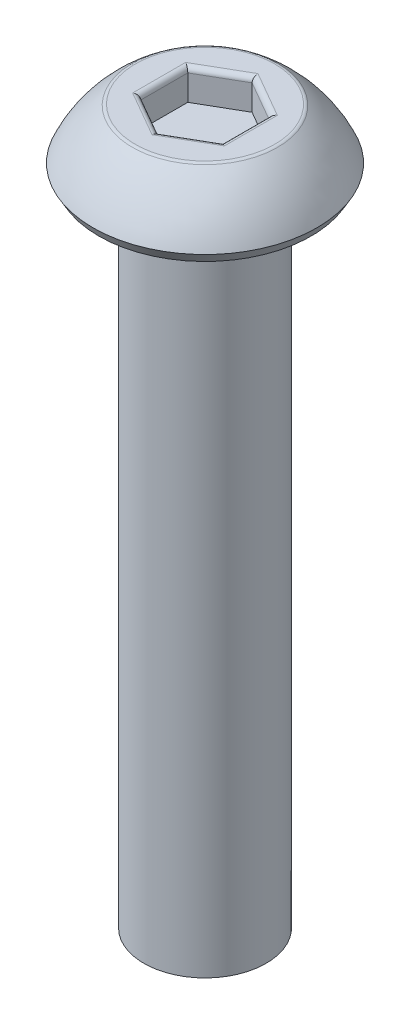
ISO-10303-21;
HEADER;
FILE_DESCRIPTION(('STEP AP214'),'2;1');
FILE_NAME('part.step','',(''),(''),'','','');
FILE_SCHEMA(('AUTOMOTIVE_DESIGN { 1 0 10303 214 1 1 1 1 }'));
ENDSEC;
DATA;
#1=APPLICATION_CONTEXT('core data for automotive mechanical design processes');
#2=APPLICATION_PROTOCOL_DEFINITION('international standard','automotive_design',2000,#1);
#3=PRODUCT_CONTEXT('',#1,'mechanical');
#4=PRODUCT('Part','Part','',(#3));
#5=PRODUCT_RELATED_PRODUCT_CATEGORY('part','',(#4));
#6=PRODUCT_DEFINITION_FORMATION('','',#4);
#7=PRODUCT_DEFINITION_CONTEXT('part definition',#1,'design');
#8=PRODUCT_DEFINITION('design','',#6,#7);
#9=PRODUCT_DEFINITION_SHAPE('','',#8);
#10=(LENGTH_UNIT() NAMED_UNIT(*) SI_UNIT(.MILLI.,.METRE.));
#11=(NAMED_UNIT(*) PLANE_ANGLE_UNIT() SI_UNIT($,.RADIAN.));
#12=(NAMED_UNIT(*) SI_UNIT($,.STERADIAN.) SOLID_ANGLE_UNIT());
#13=UNCERTAINTY_MEASURE_WITH_UNIT(LENGTH_MEASURE(1.E-05),#10,'distance_accuracy_value','');
#14=(GEOMETRIC_REPRESENTATION_CONTEXT(3) GLOBAL_UNCERTAINTY_ASSIGNED_CONTEXT((#13)) GLOBAL_UNIT_ASSIGNED_CONTEXT((#10,
#11,#12)) REPRESENTATION_CONTEXT('',''));
#15=CARTESIAN_POINT('',(0.,0.,0.));
#16=DIRECTION('',(0.,0.,1.));
#17=DIRECTION('',(1.,0.,0.));
#18=AXIS2_PLACEMENT_3D('',#15,#16,#17);
#19=CARTESIAN_POINT('',(0.,1.5,0.));
#20=DIRECTION('',(0.,-1.,0.));
#21=DIRECTION('',(0.,0.,-1.));
#22=AXIS2_PLACEMENT_3D('',#19,#20,#21);
#23=PLANE('',#22);
#24=CARTESIAN_POINT('',(0.,1.5,0.));
#25=DIRECTION('',(0.,-1.,0.));
#26=DIRECTION('',(0.,0.,-1.));
#27=AXIS2_PLACEMENT_3D('',#24,#25,#26);
#28=CIRCLE('',#27,1.70906948191647);
#29=CARTESIAN_POINT('',(0.,1.5,-1.70906948191647));
#30=VERTEX_POINT('',#29);
#31=EDGE_CURVE('E177',#30,#30,#28,.F.);
#32=ORIENTED_EDGE('',*,*,#31,.T.);
#33=EDGE_LOOP('',(#32));
#34=FACE_BOUND('',#33,.T.);
#35=DIRECTION('',(0.866025403784439,0.,-0.5));
#36=VECTOR('',#35,1.);
#37=CARTESIAN_POINT('',(0.5625,1.5,0.974278579257493));
#38=LINE('',#37,#36);
#39=CARTESIAN_POINT('',(1.125,1.5,0.649519052838329));
#40=VERTEX_POINT('',#39);
#41=CARTESIAN_POINT('',(0.,1.5,1.29903810567666));
#42=VERTEX_POINT('',#41);
#43=EDGE_CURVE('E172',#40,#42,#38,.F.);
#44=ORIENTED_EDGE('',*,*,#43,.T.);
#45=DIRECTION('',(0.866025403784439,0.,0.5));
#46=VECTOR('',#45,1.);
#47=CARTESIAN_POINT('',(-0.5625,1.5,0.974278579257493));
#48=LINE('',#47,#46);
#49=CARTESIAN_POINT('',(-1.125,1.5,0.649519052838329));
#50=VERTEX_POINT('',#49);
#51=EDGE_CURVE('E174',#42,#50,#48,.F.);
#52=ORIENTED_EDGE('',*,*,#51,.T.);
#53=DIRECTION('',(0.,0.,1.));
#54=VECTOR('',#53,1.);
#55=CARTESIAN_POINT('',(-1.125,1.5,0.));
#56=LINE('',#55,#54);
#57=CARTESIAN_POINT('',(-1.125,1.5,-0.649519052838329));
#58=VERTEX_POINT('',#57);
#59=EDGE_CURVE('E164',#50,#58,#56,.F.);
#60=ORIENTED_EDGE('',*,*,#59,.T.);
#61=DIRECTION('',(-0.866025403784439,0.,0.5));
#62=VECTOR('',#61,1.);
#63=CARTESIAN_POINT('',(-0.5625,1.5,-0.974278579257493));
#64=LINE('',#63,#62);
#65=CARTESIAN_POINT('',(0.,1.5,-1.29903810567666));
#66=VERTEX_POINT('',#65);
#67=EDGE_CURVE('E166',#58,#66,#64,.F.);
#68=ORIENTED_EDGE('',*,*,#67,.T.);
#69=DIRECTION('',(-0.866025403784439,0.,-0.5));
#70=VECTOR('',#69,1.);
#71=CARTESIAN_POINT('',(0.5625,1.5,-0.974278579257494));
#72=LINE('',#71,#70);
#73=CARTESIAN_POINT('',(1.125,1.5,-0.64951905283833));
#74=VERTEX_POINT('',#73);
#75=EDGE_CURVE('E168',#66,#74,#72,.F.);
#76=ORIENTED_EDGE('',*,*,#75,.T.);
#77=DIRECTION('',(0.,0.,-1.));
#78=VECTOR('',#77,1.);
#79=CARTESIAN_POINT('',(1.125,1.5,0.));
#80=LINE('',#79,#78);
#81=EDGE_CURVE('E170',#74,#40,#80,.F.);
#82=ORIENTED_EDGE('',*,*,#81,.T.);
#83=EDGE_LOOP('',(#44,#52,#60,#68,#76,#82));
#84=FACE_BOUND('',#83,.T.);
#85=ADVANCED_FACE('F35',(#34,#84),#23,.F.);
#86=CARTESIAN_POINT('',(0.,-0.931154789034212,0.));
#87=DIRECTION('',(0.,-1.,0.));
#88=DIRECTION('',(0.,0.,-1.));
#89=AXIS2_PLACEMENT_3D('',#86,#87,#88);
#90=DEGENERATE_TOROIDAL_SURFACE('',#89,0.00769348629276519,3.,.F.);
#91=CARTESIAN_POINT('',(0.,1.47526759952323,0.));
#92=DIRECTION('',(0.,-1.,0.));
#93=DIRECTION('',(0.,0.,-1.));
#94=AXIS2_PLACEMENT_3D('',#91,#92,#93);
#95=CIRCLE('',#94,1.78371135009948);
#96=CARTESIAN_POINT('',(0.,1.47526759952323,-1.78371135009948));
#97=VERTEX_POINT('',#96);
#98=EDGE_CURVE('E161',#97,#97,#95,.T.);
#99=ORIENTED_EDGE('',*,*,#98,.T.);
#100=EDGE_LOOP('',(#99));
#101=FACE_BOUND('',#100,.T.);
#102=CARTESIAN_POINT('',(0.,0.25,0.));
#103=DIRECTION('',(0.,-1.,0.));
#104=DIRECTION('',(0.,0.,-1.));
#105=AXIS2_PLACEMENT_3D('',#102,#103,#104);
#106=CIRCLE('',#105,2.75);
#107=CARTESIAN_POINT('',(0.,0.25,-2.75));
#108=VERTEX_POINT('',#107);
#109=EDGE_CURVE('E158',#108,#108,#106,.T.);
#110=ORIENTED_EDGE('',*,*,#109,.F.);
#111=EDGE_LOOP('',(#110));
#112=FACE_BOUND('',#111,.T.);
#113=ADVANCED_FACE('F244',(#101,#112),#90,.F.);
#114=CARTESIAN_POINT('',(0.,0.25,0.));
#115=DIRECTION('',(0.,1.,0.));
#116=DIRECTION('',(0.,0.,1.));
#117=AXIS2_PLACEMENT_3D('',#114,#115,#116);
#118=CONICAL_SURFACE('',#117,2.75,0.523598775598296);
#119=CARTESIAN_POINT('',(0.,0.,0.));
#120=DIRECTION('',(0.,-1.,0.));
#121=DIRECTION('',(0.,0.,-1.));
#122=AXIS2_PLACEMENT_3D('',#119,#120,#121);
#123=CIRCLE('',#122,2.60566243270259);
#124=CARTESIAN_POINT('',(0.,0.,-2.60566243270259));
#125=VERTEX_POINT('',#124);
#126=EDGE_CURVE('E155',#125,#125,#123,.T.);
#127=ORIENTED_EDGE('',*,*,#126,.F.);
#128=EDGE_LOOP('',(#127));
#129=FACE_BOUND('',#128,.T.);
#130=ORIENTED_EDGE('',*,*,#109,.T.);
#131=EDGE_LOOP('',(#130));
#132=FACE_BOUND('',#131,.T.);
#133=ADVANCED_FACE('F250',(#129,#132),#118,.T.);
#134=CARTESIAN_POINT('',(0.,0.,2.60566243270259));
#135=DIRECTION('',(0.,1.,0.));
#136=DIRECTION('',(0.,0.,1.));
#137=AXIS2_PLACEMENT_3D('',#134,#135,#136);
#138=PLANE('',#137);
#139=CARTESIAN_POINT('',(0.,0.,0.));
#140=DIRECTION('',(0.,-1.,0.));
#141=DIRECTION('',(0.,0.,-1.));
#142=AXIS2_PLACEMENT_3D('',#139,#140,#141);
#143=CIRCLE('',#142,1.5);
#144=CARTESIAN_POINT('',(0.,0.,-1.5));
#145=VERTEX_POINT('',#144);
#146=EDGE_CURVE('E152',#145,#145,#143,.T.);
#147=ORIENTED_EDGE('',*,*,#146,.F.);
#148=EDGE_LOOP('',(#147));
#149=FACE_BOUND('',#148,.T.);
#150=ORIENTED_EDGE('',*,*,#126,.T.);
#151=EDGE_LOOP('',(#150));
#152=FACE_BOUND('',#151,.T.);
#153=ADVANCED_FACE('F269',(#149,#152),#138,.F.);
#154=CARTESIAN_POINT('',(0.,-16.,0.));
#155=DIRECTION('',(0.,-1.,0.));
#156=DIRECTION('',(0.,0.,-1.));
#157=AXIS2_PLACEMENT_3D('',#154,#155,#156);
#158=CYLINDRICAL_SURFACE('',#157,1.5);
#159=CARTESIAN_POINT('',(0.,-16.,0.));
#160=DIRECTION('',(0.,-1.,0.));
#161=DIRECTION('',(0.,0.,-1.));
#162=AXIS2_PLACEMENT_3D('',#159,#160,#161);
#163=CIRCLE('',#162,1.5);
#164=CARTESIAN_POINT('',(0.,-16.,-1.5));
#165=VERTEX_POINT('',#164);
#166=EDGE_CURVE('E139',#165,#165,#163,.T.);
#167=ORIENTED_EDGE('',*,*,#166,.F.);
#168=EDGE_LOOP('',(#167));
#169=FACE_BOUND('',#168,.T.);
#170=ORIENTED_EDGE('',*,*,#146,.T.);
#171=EDGE_LOOP('',(#170));
#172=FACE_BOUND('',#171,.T.);
#173=ADVANCED_FACE('F274',(#169,#172),#158,.T.);
#174=CARTESIAN_POINT('',(0.,-16.,1.5));
#175=DIRECTION('',(0.,1.,0.));
#176=DIRECTION('',(0.,0.,1.));
#177=AXIS2_PLACEMENT_3D('',#174,#175,#176);
#178=PLANE('',#177);
#179=ORIENTED_EDGE('',*,*,#166,.T.);
#180=EDGE_LOOP('',(#179));
#181=FACE_BOUND('',#180,.T.);
#182=ADVANCED_FACE('F281',(#181),#178,.F.);
#183=CARTESIAN_POINT('',(0.999999999999999,0.75,-0.577350269189626));
#184=DIRECTION('',(0.5,0.,-0.866025403784439));
#185=DIRECTION('',(-0.866025403784439,0.,-0.5));
#186=AXIS2_PLACEMENT_3D('',#183,#184,#185);
#187=PLANE('',#186);
#188=DIRECTION('',(0.,1.,0.));
#189=VECTOR('',#188,1.);
#190=CARTESIAN_POINT('',(0.999999999999999,0.75,-0.577350269189626));
#191=LINE('',#190,#189);
#192=CARTESIAN_POINT('',(0.999999999999999,0.75,-0.577350269189626));
#193=VERTEX_POINT('',#192);
#194=CARTESIAN_POINT('',(0.999999999999999,1.375,-0.577350269189626));
#195=VERTEX_POINT('',#194);
#196=EDGE_CURVE('E137',#193,#195,#191,.T.);
#197=ORIENTED_EDGE('',*,*,#196,.T.);
#198=DIRECTION('',(-0.866025403784439,0.,-0.5));
#199=VECTOR('',#198,1.);
#200=CARTESIAN_POINT('',(0.999999999999999,1.375,-0.577350269189626));
#201=LINE('',#200,#199);
#202=CARTESIAN_POINT('',(0.,1.375,-1.15470053837925));
#203=VERTEX_POINT('',#202);
#204=EDGE_CURVE('E59',#195,#203,#201,.T.);
#205=ORIENTED_EDGE('',*,*,#204,.T.);
#206=DIRECTION('',(0.,1.,0.));
#207=VECTOR('',#206,1.);
#208=CARTESIAN_POINT('',(0.,0.75,-1.15470053837925));
#209=LINE('',#208,#207);
#210=CARTESIAN_POINT('',(0.,0.75,-1.15470053837925));
#211=VERTEX_POINT('',#210);
#212=EDGE_CURVE('E105',#211,#203,#209,.T.);
#213=ORIENTED_EDGE('',*,*,#212,.F.);
#214=DIRECTION('',(-0.866025403784439,0.,-0.5));
#215=VECTOR('',#214,1.);
#216=CARTESIAN_POINT('',(0.999999999999999,0.75,-0.577350269189626));
#217=LINE('',#216,#215);
#218=EDGE_CURVE('E109',#193,#211,#217,.T.);
#219=ORIENTED_EDGE('',*,*,#218,.F.);
#220=EDGE_LOOP('',(#197,#205,#213,#219));
#221=FACE_BOUND('',#220,.T.);
#222=ADVANCED_FACE('F107',(#221),#187,.F.);
#223=CARTESIAN_POINT('',(1.,0.75,0.577350269189626));
#224=DIRECTION('',(1.,0.,0.));
#225=DIRECTION('',(0.,0.,-1.));
#226=AXIS2_PLACEMENT_3D('',#223,#224,#225);
#227=PLANE('',#226);
#228=DIRECTION('',(0.,1.,0.));
#229=VECTOR('',#228,1.);
#230=CARTESIAN_POINT('',(1.,0.75,0.577350269189626));
#231=LINE('',#230,#229);
#232=CARTESIAN_POINT('',(1.,0.75,0.577350269189626));
#233=VERTEX_POINT('',#232);
#234=CARTESIAN_POINT('',(1.,1.375,0.577350269189626));
#235=VERTEX_POINT('',#234);
#236=EDGE_CURVE('E140',#233,#235,#231,.T.);
#237=ORIENTED_EDGE('',*,*,#236,.T.);
#238=DIRECTION('',(0.,0.,-1.));
#239=VECTOR('',#238,1.);
#240=CARTESIAN_POINT('',(1.,1.375,0.577350269189626));
#241=LINE('',#240,#239);
#242=EDGE_CURVE('E185',#235,#195,#241,.T.);
#243=ORIENTED_EDGE('',*,*,#242,.T.);
#244=ORIENTED_EDGE('',*,*,#196,.F.);
#245=DIRECTION('',(0.,0.,-1.));
#246=VECTOR('',#245,1.);
#247=CARTESIAN_POINT('',(1.,0.75,0.577350269189626));
#248=LINE('',#247,#246);
#249=EDGE_CURVE('E113',#233,#193,#248,.T.);
#250=ORIENTED_EDGE('',*,*,#249,.F.);
#251=EDGE_LOOP('',(#237,#243,#244,#250));
#252=FACE_BOUND('',#251,.T.);
#253=ADVANCED_FACE('F225',(#252),#227,.F.);
#254=CARTESIAN_POINT('',(0.,0.75,1.15470053837925));
#255=DIRECTION('',(0.5,0.,0.866025403784439));
#256=DIRECTION('',(0.866025403784439,0.,-0.5));
#257=AXIS2_PLACEMENT_3D('',#254,#255,#256);
#258=PLANE('',#257);
#259=DIRECTION('',(0.,1.,0.));
#260=VECTOR('',#259,1.);
#261=CARTESIAN_POINT('',(0.,0.75,1.15470053837925));
#262=LINE('',#261,#260);
#263=CARTESIAN_POINT('',(0.,0.75,1.15470053837925));
#264=VERTEX_POINT('',#263);
#265=CARTESIAN_POINT('',(0.,1.375,1.15470053837925));
#266=VERTEX_POINT('',#265);
#267=EDGE_CURVE('E143',#264,#266,#262,.T.);
#268=ORIENTED_EDGE('',*,*,#267,.T.);
#269=DIRECTION('',(0.866025403784439,0.,-0.5));
#270=VECTOR('',#269,1.);
#271=CARTESIAN_POINT('',(0.,1.375,1.15470053837925));
#272=LINE('',#271,#270);
#273=EDGE_CURVE('E183',#266,#235,#272,.T.);
#274=ORIENTED_EDGE('',*,*,#273,.T.);
#275=ORIENTED_EDGE('',*,*,#236,.F.);
#276=DIRECTION('',(0.866025403784439,0.,-0.5));
#277=VECTOR('',#276,1.);
#278=CARTESIAN_POINT('',(0.,0.75,1.15470053837925));
#279=LINE('',#278,#277);
#280=EDGE_CURVE('E134',#264,#233,#279,.T.);
#281=ORIENTED_EDGE('',*,*,#280,.F.);
#282=EDGE_LOOP('',(#268,#274,#275,#281));
#283=FACE_BOUND('',#282,.T.);
#284=ADVANCED_FACE('F226',(#283),#258,.F.);
#285=CARTESIAN_POINT('',(-0.999999999999999,0.75,0.577350269189626));
#286=DIRECTION('',(-0.5,0.,0.866025403784439));
#287=DIRECTION('',(0.866025403784439,0.,0.5));
#288=AXIS2_PLACEMENT_3D('',#285,#286,#287);
#289=PLANE('',#288);
#290=DIRECTION('',(0.,1.,0.));
#291=VECTOR('',#290,1.);
#292=CARTESIAN_POINT('',(-0.999999999999999,0.75,0.577350269189626));
#293=LINE('',#292,#291);
#294=CARTESIAN_POINT('',(-0.999999999999999,0.75,0.577350269189626));
#295=VERTEX_POINT('',#294);
#296=CARTESIAN_POINT('',(-0.999999999999999,1.375,0.577350269189626));
#297=VERTEX_POINT('',#296);
#298=EDGE_CURVE('E146',#295,#297,#293,.T.);
#299=ORIENTED_EDGE('',*,*,#298,.T.);
#300=DIRECTION('',(0.866025403784439,0.,0.5));
#301=VECTOR('',#300,1.);
#302=CARTESIAN_POINT('',(-0.999999999999999,1.375,0.577350269189626));
#303=LINE('',#302,#301);
#304=EDGE_CURVE('E180',#297,#266,#303,.T.);
#305=ORIENTED_EDGE('',*,*,#304,.T.);
#306=ORIENTED_EDGE('',*,*,#267,.F.);
#307=DIRECTION('',(0.866025403784439,0.,0.5));
#308=VECTOR('',#307,1.);
#309=CARTESIAN_POINT('',(-0.999999999999999,0.75,0.577350269189626));
#310=LINE('',#309,#308);
#311=EDGE_CURVE('E131',#295,#264,#310,.T.);
#312=ORIENTED_EDGE('',*,*,#311,.F.);
#313=EDGE_LOOP('',(#299,#305,#306,#312));
#314=FACE_BOUND('',#313,.T.);
#315=ADVANCED_FACE('F221',(#314),#289,.F.);
#316=CARTESIAN_POINT('',(-1.,0.75,-0.577350269189626));
#317=DIRECTION('',(-1.,0.,0.));
#318=DIRECTION('',(0.,0.,1.));
#319=AXIS2_PLACEMENT_3D('',#316,#317,#318);
#320=PLANE('',#319);
#321=DIRECTION('',(0.,1.,0.));
#322=VECTOR('',#321,1.);
#323=CARTESIAN_POINT('',(-1.,0.75,-0.577350269189626));
#324=LINE('',#323,#322);
#325=CARTESIAN_POINT('',(-1.,0.75,-0.577350269189626));
#326=VERTEX_POINT('',#325);
#327=CARTESIAN_POINT('',(-1.,1.375,-0.577350269189626));
#328=VERTEX_POINT('',#327);
#329=EDGE_CURVE('E112',#326,#328,#324,.T.);
#330=ORIENTED_EDGE('',*,*,#329,.T.);
#331=DIRECTION('',(0.,0.,1.));
#332=VECTOR('',#331,1.);
#333=CARTESIAN_POINT('',(-1.,1.375,-0.577350269189626));
#334=LINE('',#333,#332);
#335=EDGE_CURVE('E11',#328,#297,#334,.T.);
#336=ORIENTED_EDGE('',*,*,#335,.T.);
#337=ORIENTED_EDGE('',*,*,#298,.F.);
#338=DIRECTION('',(0.,0.,1.));
#339=VECTOR('',#338,1.);
#340=CARTESIAN_POINT('',(-1.,0.75,-0.577350269189626));
#341=LINE('',#340,#339);
#342=EDGE_CURVE('E121',#326,#295,#341,.T.);
#343=ORIENTED_EDGE('',*,*,#342,.F.);
#344=EDGE_LOOP('',(#330,#336,#337,#343));
#345=FACE_BOUND('',#344,.T.);
#346=ADVANCED_FACE('F218',(#345),#320,.F.);
#347=CARTESIAN_POINT('',(0.,0.75,-1.15470053837925));
#348=DIRECTION('',(-0.5,0.,-0.866025403784438));
#349=DIRECTION('',(-0.866025403784439,0.,0.5));
#350=AXIS2_PLACEMENT_3D('',#347,#348,#349);
#351=PLANE('',#350);
#352=ORIENTED_EDGE('',*,*,#212,.T.);
#353=DIRECTION('',(-0.866025403784439,0.,0.5));
#354=VECTOR('',#353,1.);
#355=CARTESIAN_POINT('',(0.,1.375,-1.15470053837925));
#356=LINE('',#355,#354);
#357=EDGE_CURVE('E44',#203,#328,#356,.T.);
#358=ORIENTED_EDGE('',*,*,#357,.T.);
#359=ORIENTED_EDGE('',*,*,#329,.F.);
#360=DIRECTION('',(-0.866025403784439,0.,0.5));
#361=VECTOR('',#360,1.);
#362=CARTESIAN_POINT('',(0.,0.75,-1.15470053837925));
#363=LINE('',#362,#361);
#364=EDGE_CURVE('E116',#211,#326,#363,.T.);
#365=ORIENTED_EDGE('',*,*,#364,.F.);
#366=EDGE_LOOP('',(#352,#358,#359,#365));
#367=FACE_BOUND('',#366,.T.);
#368=ADVANCED_FACE('F117',(#367),#351,.F.);
#369=CARTESIAN_POINT('',(0.,0.75,0.));
#370=DIRECTION('',(0.,1.,0.));
#371=DIRECTION('',(0.,0.,1.));
#372=AXIS2_PLACEMENT_3D('',#369,#370,#371);
#373=PLANE('',#372);
#374=ORIENTED_EDGE('',*,*,#218,.T.);
#375=ORIENTED_EDGE('',*,*,#364,.T.);
#376=ORIENTED_EDGE('',*,*,#342,.T.);
#377=ORIENTED_EDGE('',*,*,#311,.T.);
#378=ORIENTED_EDGE('',*,*,#280,.T.);
#379=ORIENTED_EDGE('',*,*,#249,.T.);
#380=EDGE_LOOP('',(#374,#375,#376,#377,#378,#379));
#381=FACE_BOUND('',#380,.T.);
#382=ADVANCED_FACE('F123',(#381),#373,.T.);
#383=CARTESIAN_POINT('',(0.,1.375,0.));
#384=DIRECTION('',(0.,-1.,0.));
#385=DIRECTION('',(0.,0.,-1.));
#386=AXIS2_PLACEMENT_3D('',#383,#384,#385);
#387=TOROIDAL_SURFACE('',#386,1.70906948191647,0.125);
#388=ORIENTED_EDGE('',*,*,#31,.F.);
#389=EDGE_LOOP('',(#388));
#390=FACE_BOUND('',#389,.T.);
#391=ORIENTED_EDGE('',*,*,#98,.F.);
#392=EDGE_LOOP('',(#391));
#393=FACE_BOUND('',#392,.T.);
#394=ADVANCED_FACE('F254',(#390,#393),#387,.T.);
#395=CARTESIAN_POINT('',(1.0625,1.375,-0.685603444662681));
#396=DIRECTION('',(-0.866025403784439,0.,-0.5));
#397=DIRECTION('',(-0.5,0.,0.866025403784439));
#398=AXIS2_PLACEMENT_3D('',#395,#396,#397);
#399=CYLINDRICAL_SURFACE('',#398,0.125);
#400=CARTESIAN_POINT('',(1.125,1.375,-0.64951905283833));
#401=DIRECTION('',(-0.5,0.,-0.866025403784438));
#402=DIRECTION('',(0.866025403784439,0.,-0.5));
#403=AXIS2_PLACEMENT_3D('',#400,#401,#402);
#404=ELLIPSE('',#403,0.144337567297406,0.125);
#405=EDGE_CURVE('E128',#74,#195,#404,.F.);
#406=ORIENTED_EDGE('',*,*,#405,.F.);
#407=ORIENTED_EDGE('',*,*,#75,.F.);
#408=CARTESIAN_POINT('',(0.,1.375,-1.29903810567666));
#409=DIRECTION('',(-1.,0.,0.));
#410=DIRECTION('',(0.,0.,-1.));
#411=AXIS2_PLACEMENT_3D('',#408,#409,#410);
#412=ELLIPSE('',#411,0.144337567297406,0.125);
#413=EDGE_CURVE('E39',#203,#66,#412,.T.);
#414=ORIENTED_EDGE('',*,*,#413,.F.);
#415=ORIENTED_EDGE('',*,*,#204,.F.);
#416=EDGE_LOOP('',(#406,#407,#414,#415));
#417=FACE_BOUND('',#416,.T.);
#418=ADVANCED_FACE('F37',(#417),#399,.T.);
#419=CARTESIAN_POINT('',(-0.0625000000000002,1.375,-1.26295371385231));
#420=DIRECTION('',(-0.866025403784439,0.,0.5));
#421=DIRECTION('',(0.5,0.,0.866025403784439));
#422=AXIS2_PLACEMENT_3D('',#419,#420,#421);
#423=CYLINDRICAL_SURFACE('',#422,0.125);
#424=ORIENTED_EDGE('',*,*,#413,.T.);
#425=ORIENTED_EDGE('',*,*,#67,.F.);
#426=CARTESIAN_POINT('',(-1.125,1.375,-0.649519052838329));
#427=DIRECTION('',(-0.5,0.,0.866025403784439));
#428=DIRECTION('',(-0.866025403784439,0.,-0.5));
#429=AXIS2_PLACEMENT_3D('',#426,#427,#428);
#430=ELLIPSE('',#429,0.144337567297406,0.125);
#431=EDGE_CURVE('E196',#328,#58,#430,.T.);
#432=ORIENTED_EDGE('',*,*,#431,.F.);
#433=ORIENTED_EDGE('',*,*,#357,.F.);
#434=EDGE_LOOP('',(#424,#425,#432,#433));
#435=FACE_BOUND('',#434,.T.);
#436=ADVANCED_FACE('F210',(#435),#423,.T.);
#437=CARTESIAN_POINT('',(1.125,1.375,0.577350269189626));
#438=DIRECTION('',(0.,0.,-1.));
#439=DIRECTION('',(-1.,0.,0.));
#440=AXIS2_PLACEMENT_3D('',#437,#438,#439);
#441=CYLINDRICAL_SURFACE('',#440,0.125);
#442=ORIENTED_EDGE('',*,*,#405,.T.);
#443=ORIENTED_EDGE('',*,*,#242,.F.);
#444=CARTESIAN_POINT('',(1.125,1.375,0.649519052838329));
#445=DIRECTION('',(0.5,0.,-0.866025403784439));
#446=DIRECTION('',(0.866025403784439,0.,0.5));
#447=AXIS2_PLACEMENT_3D('',#444,#445,#446);
#448=ELLIPSE('',#447,0.144337567297406,0.125);
#449=EDGE_CURVE('E193',#40,#235,#448,.F.);
#450=ORIENTED_EDGE('',*,*,#449,.F.);
#451=ORIENTED_EDGE('',*,*,#81,.F.);
#452=EDGE_LOOP('',(#442,#443,#450,#451));
#453=FACE_BOUND('',#452,.T.);
#454=ADVANCED_FACE('F203',(#453),#441,.T.);
#455=CARTESIAN_POINT('',(-1.125,1.375,-0.577350269189626));
#456=DIRECTION('',(0.,0.,1.));
#457=DIRECTION('',(1.,0.,0.));
#458=AXIS2_PLACEMENT_3D('',#455,#456,#457);
#459=CYLINDRICAL_SURFACE('',#458,0.125);
#460=ORIENTED_EDGE('',*,*,#431,.T.);
#461=ORIENTED_EDGE('',*,*,#59,.F.);
#462=CARTESIAN_POINT('',(-1.125,1.375,0.649519052838329));
#463=DIRECTION('',(0.5,0.,0.866025403784438));
#464=DIRECTION('',(0.866025403784439,0.,-0.5));
#465=AXIS2_PLACEMENT_3D('',#462,#463,#464);
#466=ELLIPSE('',#465,0.144337567297406,0.125);
#467=EDGE_CURVE('E191',#297,#50,#466,.T.);
#468=ORIENTED_EDGE('',*,*,#467,.F.);
#469=ORIENTED_EDGE('',*,*,#335,.F.);
#470=EDGE_LOOP('',(#460,#461,#468,#469));
#471=FACE_BOUND('',#470,.T.);
#472=ADVANCED_FACE('F215',(#471),#459,.T.);
#473=CARTESIAN_POINT('',(0.0625000000000004,1.375,1.26295371385231));
#474=DIRECTION('',(0.866025403784439,0.,-0.5));
#475=DIRECTION('',(-0.5,0.,-0.866025403784439));
#476=AXIS2_PLACEMENT_3D('',#473,#474,#475);
#477=CYLINDRICAL_SURFACE('',#476,0.125);
#478=ORIENTED_EDGE('',*,*,#449,.T.);
#479=ORIENTED_EDGE('',*,*,#273,.F.);
#480=CARTESIAN_POINT('',(0.,1.375,1.29903810567666));
#481=DIRECTION('',(1.,0.,0.));
#482=DIRECTION('',(0.,0.,1.));
#483=AXIS2_PLACEMENT_3D('',#480,#481,#482);
#484=ELLIPSE('',#483,0.144337567297406,0.125);
#485=EDGE_CURVE('E189',#42,#266,#484,.F.);
#486=ORIENTED_EDGE('',*,*,#485,.F.);
#487=ORIENTED_EDGE('',*,*,#43,.F.);
#488=EDGE_LOOP('',(#478,#479,#486,#487));
#489=FACE_BOUND('',#488,.T.);
#490=ADVANCED_FACE('F230',(#489),#477,.T.);
#491=CARTESIAN_POINT('',(-1.0625,1.375,0.685603444662681));
#492=DIRECTION('',(0.866025403784439,0.,0.5));
#493=DIRECTION('',(0.5,0.,-0.866025403784439));
#494=AXIS2_PLACEMENT_3D('',#491,#492,#493);
#495=CYLINDRICAL_SURFACE('',#494,0.125);
#496=ORIENTED_EDGE('',*,*,#467,.T.);
#497=ORIENTED_EDGE('',*,*,#51,.F.);
#498=ORIENTED_EDGE('',*,*,#485,.T.);
#499=ORIENTED_EDGE('',*,*,#304,.F.);
#500=EDGE_LOOP('',(#496,#497,#498,#499));
#501=FACE_BOUND('',#500,.T.);
#502=ADVANCED_FACE('F235',(#501),#495,.T.);
#503=CLOSED_SHELL('',(#85,#113,#133,#153,#173,#182,#222,#253,#284,#315,#346,#368,#382,#394,#418,
#436,#454,#472,#490,#502));
#504=MANIFOLD_SOLID_BREP('B2',#503);
#505=ADVANCED_BREP_SHAPE_REPRESENTATION('',(#18,#504),#14);
#506=SHAPE_DEFINITION_REPRESENTATION(#9,#505);
ENDSEC;
END-ISO-10303-21;
